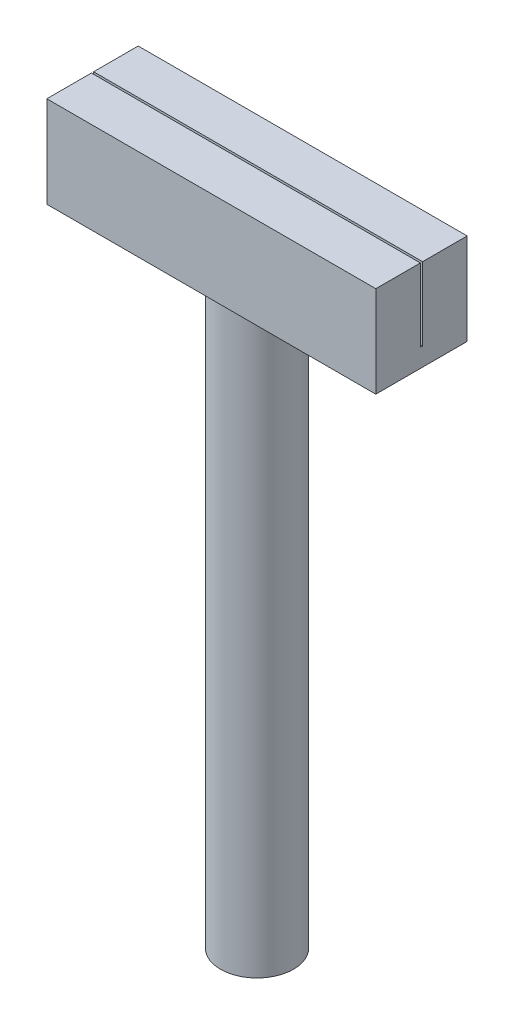
ISO-10303-21;
HEADER;
FILE_DESCRIPTION(('STEP AP214'),'2;1');
FILE_NAME('part.step','',(''),(''),'','','');
FILE_SCHEMA(('AUTOMOTIVE_DESIGN { 1 0 10303 214 1 1 1 1 }'));
ENDSEC;
DATA;
#1=APPLICATION_CONTEXT('core data for automotive mechanical design processes');
#2=APPLICATION_PROTOCOL_DEFINITION('international standard','automotive_design',2000,#1);
#3=PRODUCT_CONTEXT('',#1,'mechanical');
#4=PRODUCT('Part','Part','',(#3));
#5=PRODUCT_RELATED_PRODUCT_CATEGORY('part','',(#4));
#6=PRODUCT_DEFINITION_FORMATION('','',#4);
#7=PRODUCT_DEFINITION_CONTEXT('part definition',#1,'design');
#8=PRODUCT_DEFINITION('design','',#6,#7);
#9=PRODUCT_DEFINITION_SHAPE('','',#8);
#10=(LENGTH_UNIT() NAMED_UNIT(*) SI_UNIT(.MILLI.,.METRE.));
#11=(NAMED_UNIT(*) PLANE_ANGLE_UNIT() SI_UNIT($,.RADIAN.));
#12=(NAMED_UNIT(*) SI_UNIT($,.STERADIAN.) SOLID_ANGLE_UNIT());
#13=UNCERTAINTY_MEASURE_WITH_UNIT(LENGTH_MEASURE(1.E-05),#10,'distance_accuracy_value','');
#14=(GEOMETRIC_REPRESENTATION_CONTEXT(3) GLOBAL_UNCERTAINTY_ASSIGNED_CONTEXT((#13)) GLOBAL_UNIT_ASSIGNED_CONTEXT((#10,
#11,#12)) REPRESENTATION_CONTEXT('',''));
#15=CARTESIAN_POINT('',(0.,0.,0.));
#16=DIRECTION('',(0.,0.,1.));
#17=DIRECTION('',(1.,0.,0.));
#18=AXIS2_PLACEMENT_3D('',#15,#16,#17);
#19=CARTESIAN_POINT('',(0.,92.5,0.));
#20=DIRECTION('',(0.,-1.,0.));
#21=DIRECTION('',(0.,0.,-1.));
#22=AXIS2_PLACEMENT_3D('',#19,#20,#21);
#23=PLANE('',#22);
#24=DIRECTION('',(1.,0.,0.));
#25=VECTOR('',#24,1.);
#26=CARTESIAN_POINT('',(-22.499999958,92.5,0.15));
#27=LINE('',#26,#25);
#28=CARTESIAN_POINT('',(-22.499999958,92.5,0.15));
#29=VERTEX_POINT('',#28);
#30=CARTESIAN_POINT('',(22.499999958,92.5,0.15));
#31=VERTEX_POINT('',#30);
#32=EDGE_CURVE('E120',#29,#31,#27,.T.);
#33=ORIENTED_EDGE('',*,*,#32,.F.);
#34=DIRECTION('',(0.,0.,-1.));
#35=VECTOR('',#34,1.);
#36=CARTESIAN_POINT('',(-22.499999958,92.5,0.));
#37=LINE('',#36,#35);
#38=CARTESIAN_POINT('',(-22.499999958,92.5,6.25));
#39=VERTEX_POINT('',#38);
#40=EDGE_CURVE('E152',#39,#29,#37,.T.);
#41=ORIENTED_EDGE('',*,*,#40,.F.);
#42=DIRECTION('',(-1.,0.,0.));
#43=VECTOR('',#42,1.);
#44=CARTESIAN_POINT('',(0.,92.5,6.25));
#45=LINE('',#44,#43);
#46=CARTESIAN_POINT('',(22.499999958,92.5,6.25));
#47=VERTEX_POINT('',#46);
#48=EDGE_CURVE('E143',#47,#39,#45,.T.);
#49=ORIENTED_EDGE('',*,*,#48,.F.);
#50=DIRECTION('',(0.,0.,1.));
#51=VECTOR('',#50,1.);
#52=CARTESIAN_POINT('',(22.499999958,92.5,0.));
#53=LINE('',#52,#51);
#54=EDGE_CURVE('E131',#31,#47,#53,.T.);
#55=ORIENTED_EDGE('',*,*,#54,.F.);
#56=EDGE_LOOP('',(#33,#41,#49,#55));
#57=FACE_BOUND('',#56,.T.);
#58=ADVANCED_FACE('F44',(#57),#23,.F.);
#59=CARTESIAN_POINT('',(-22.499999958,92.5,0.));
#60=DIRECTION('',(-1.,0.,0.));
#61=DIRECTION('',(0.,0.,1.));
#62=AXIS2_PLACEMENT_3D('',#59,#60,#61);
#63=PLANE('',#62);
#64=DIRECTION('',(0.,0.,-1.));
#65=VECTOR('',#64,1.);
#66=CARTESIAN_POINT('',(-22.499999958,82.5,0.149999999999999));
#67=LINE('',#66,#65);
#68=CARTESIAN_POINT('',(-22.499999958,82.5,0.149999999999999));
#69=VERTEX_POINT('',#68);
#70=CARTESIAN_POINT('',(-22.499999958,82.5,-0.150000000000001));
#71=VERTEX_POINT('',#70);
#72=EDGE_CURVE('E229',#69,#71,#67,.T.);
#73=ORIENTED_EDGE('',*,*,#72,.T.);
#74=DIRECTION('',(0.,1.,0.));
#75=VECTOR('',#74,1.);
#76=CARTESIAN_POINT('',(-22.499999958,92.5,-0.15));
#77=LINE('',#76,#75);
#78=CARTESIAN_POINT('',(-22.499999958,92.5,-0.15));
#79=VERTEX_POINT('',#78);
#80=EDGE_CURVE('E126',#71,#79,#77,.T.);
#81=ORIENTED_EDGE('',*,*,#80,.T.);
#82=CARTESIAN_POINT('',(-22.499999958,92.5,-6.25));
#83=VERTEX_POINT('',#82);
#84=EDGE_CURVE('E69',#79,#83,#37,.T.);
#85=ORIENTED_EDGE('',*,*,#84,.T.);
#86=DIRECTION('',(0.,-1.,0.));
#87=VECTOR('',#86,1.);
#88=CARTESIAN_POINT('',(-22.499999958,92.5,-6.25));
#89=LINE('',#88,#87);
#90=CARTESIAN_POINT('',(-22.499999958,80.,-6.25));
#91=VERTEX_POINT('',#90);
#92=EDGE_CURVE('E90',#83,#91,#89,.T.);
#93=ORIENTED_EDGE('',*,*,#92,.T.);
#94=DIRECTION('',(0.,0.,-1.));
#95=VECTOR('',#94,1.);
#96=CARTESIAN_POINT('',(-22.499999958,80.,0.));
#97=LINE('',#96,#95);
#98=CARTESIAN_POINT('',(-22.499999958,80.,6.25));
#99=VERTEX_POINT('',#98);
#100=EDGE_CURVE('E149',#99,#91,#97,.T.);
#101=ORIENTED_EDGE('',*,*,#100,.F.);
#102=DIRECTION('',(0.,-1.,0.));
#103=VECTOR('',#102,1.);
#104=CARTESIAN_POINT('',(-22.499999958,92.5,6.25));
#105=LINE('',#104,#103);
#106=EDGE_CURVE('E172',#39,#99,#105,.T.);
#107=ORIENTED_EDGE('',*,*,#106,.F.);
#108=ORIENTED_EDGE('',*,*,#40,.T.);
#109=DIRECTION('',(0.,-1.,0.));
#110=VECTOR('',#109,1.);
#111=CARTESIAN_POINT('',(-22.499999958,92.5,0.15));
#112=LINE('',#111,#110);
#113=EDGE_CURVE('E123',#29,#69,#112,.T.);
#114=ORIENTED_EDGE('',*,*,#113,.T.);
#115=EDGE_LOOP('',(#73,#81,#85,#93,#101,#107,#108,#114));
#116=FACE_BOUND('',#115,.T.);
#117=ADVANCED_FACE('F188',(#116),#63,.T.);
#118=CARTESIAN_POINT('',(0.,80.,0.));
#119=DIRECTION('',(0.,-1.,0.));
#120=DIRECTION('',(0.,0.,-1.));
#121=AXIS2_PLACEMENT_3D('',#118,#119,#120);
#122=CYLINDRICAL_SURFACE('',#121,5.);
#123=CARTESIAN_POINT('',(0.,80.,0.));
#124=DIRECTION('',(0.,1.,0.));
#125=DIRECTION('',(0.,0.,1.));
#126=AXIS2_PLACEMENT_3D('',#123,#124,#125);
#127=CIRCLE('',#126,5.);
#128=CARTESIAN_POINT('',(0.,80.,5.));
#129=VERTEX_POINT('',#128);
#130=EDGE_CURVE('E11',#129,#129,#127,.T.);
#131=ORIENTED_EDGE('',*,*,#130,.F.);
#132=EDGE_LOOP('',(#131));
#133=FACE_BOUND('',#132,.T.);
#134=CARTESIAN_POINT('',(0.,0.,0.));
#135=DIRECTION('',(0.,1.,0.));
#136=DIRECTION('',(0.,0.,1.));
#137=AXIS2_PLACEMENT_3D('',#134,#135,#136);
#138=CIRCLE('',#137,5.);
#139=CARTESIAN_POINT('',(0.,0.,5.));
#140=VERTEX_POINT('',#139);
#141=EDGE_CURVE('E47',#140,#140,#138,.T.);
#142=ORIENTED_EDGE('',*,*,#141,.T.);
#143=EDGE_LOOP('',(#142));
#144=FACE_BOUND('',#143,.T.);
#145=ADVANCED_FACE('F50',(#133,#144),#122,.T.);
#146=CARTESIAN_POINT('',(0.,0.,0.));
#147=DIRECTION('',(0.,1.,0.));
#148=DIRECTION('',(0.,0.,1.));
#149=AXIS2_PLACEMENT_3D('',#146,#147,#148);
#150=PLANE('',#149);
#151=ORIENTED_EDGE('',*,*,#141,.F.);
#152=EDGE_LOOP('',(#151));
#153=FACE_BOUND('',#152,.T.);
#154=ADVANCED_FACE('F203',(#153),#150,.F.);
#155=CARTESIAN_POINT('',(0.,92.5,-6.25));
#156=DIRECTION('',(0.,0.,-1.));
#157=DIRECTION('',(-1.,0.,0.));
#158=AXIS2_PLACEMENT_3D('',#155,#156,#157);
#159=PLANE('',#158);
#160=DIRECTION('',(1.,0.,0.));
#161=VECTOR('',#160,1.);
#162=CARTESIAN_POINT('',(0.,80.,-6.25));
#163=LINE('',#162,#161);
#164=CARTESIAN_POINT('',(22.499999958,80.,-6.25));
#165=VERTEX_POINT('',#164);
#166=EDGE_CURVE('E160',#91,#165,#163,.T.);
#167=ORIENTED_EDGE('',*,*,#166,.F.);
#168=ORIENTED_EDGE('',*,*,#92,.F.);
#169=DIRECTION('',(1.,0.,0.));
#170=VECTOR('',#169,1.);
#171=CARTESIAN_POINT('',(0.,92.5,-6.25));
#172=LINE('',#171,#170);
#173=CARTESIAN_POINT('',(22.499999958,92.5,-6.25));
#174=VERTEX_POINT('',#173);
#175=EDGE_CURVE('E145',#83,#174,#172,.T.);
#176=ORIENTED_EDGE('',*,*,#175,.T.);
#177=DIRECTION('',(0.,-1.,0.));
#178=VECTOR('',#177,1.);
#179=CARTESIAN_POINT('',(22.499999958,92.5,-6.25));
#180=LINE('',#179,#178);
#181=EDGE_CURVE('E96',#174,#165,#180,.T.);
#182=ORIENTED_EDGE('',*,*,#181,.T.);
#183=EDGE_LOOP('',(#167,#168,#176,#182));
#184=FACE_BOUND('',#183,.T.);
#185=ADVANCED_FACE('F181',(#184),#159,.T.);
#186=CARTESIAN_POINT('',(0.,92.5,6.25));
#187=DIRECTION('',(0.,0.,1.));
#188=DIRECTION('',(1.,0.,0.));
#189=AXIS2_PLACEMENT_3D('',#186,#187,#188);
#190=PLANE('',#189);
#191=DIRECTION('',(-1.,0.,0.));
#192=VECTOR('',#191,1.);
#193=CARTESIAN_POINT('',(0.,80.,6.25));
#194=LINE('',#193,#192);
#195=CARTESIAN_POINT('',(22.499999958,80.,6.25));
#196=VERTEX_POINT('',#195);
#197=EDGE_CURVE('E167',#196,#99,#194,.T.);
#198=ORIENTED_EDGE('',*,*,#197,.F.);
#199=DIRECTION('',(0.,-1.,0.));
#200=VECTOR('',#199,1.);
#201=CARTESIAN_POINT('',(22.499999958,92.5,6.25));
#202=LINE('',#201,#200);
#203=EDGE_CURVE('E176',#47,#196,#202,.T.);
#204=ORIENTED_EDGE('',*,*,#203,.F.);
#205=ORIENTED_EDGE('',*,*,#48,.T.);
#206=ORIENTED_EDGE('',*,*,#106,.T.);
#207=EDGE_LOOP('',(#198,#204,#205,#206));
#208=FACE_BOUND('',#207,.T.);
#209=ADVANCED_FACE('F193',(#208),#190,.T.);
#210=CARTESIAN_POINT('',(22.499999958,92.5,0.));
#211=DIRECTION('',(1.,0.,0.));
#212=DIRECTION('',(0.,0.,-1.));
#213=AXIS2_PLACEMENT_3D('',#210,#211,#212);
#214=PLANE('',#213);
#215=DIRECTION('',(0.,-1.,0.));
#216=VECTOR('',#215,1.);
#217=CARTESIAN_POINT('',(22.499999958,92.5,0.15));
#218=LINE('',#217,#216);
#219=CARTESIAN_POINT('',(22.499999958,82.5,0.149999999999999));
#220=VERTEX_POINT('',#219);
#221=EDGE_CURVE('E64',#31,#220,#218,.T.);
#222=ORIENTED_EDGE('',*,*,#221,.F.);
#223=ORIENTED_EDGE('',*,*,#54,.T.);
#224=ORIENTED_EDGE('',*,*,#203,.T.);
#225=DIRECTION('',(0.,0.,1.));
#226=VECTOR('',#225,1.);
#227=CARTESIAN_POINT('',(22.499999958,80.,0.));
#228=LINE('',#227,#226);
#229=EDGE_CURVE('E161',#165,#196,#228,.T.);
#230=ORIENTED_EDGE('',*,*,#229,.F.);
#231=ORIENTED_EDGE('',*,*,#181,.F.);
#232=CARTESIAN_POINT('',(22.499999958,92.5,-0.15));
#233=VERTEX_POINT('',#232);
#234=EDGE_CURVE('E141',#174,#233,#53,.T.);
#235=ORIENTED_EDGE('',*,*,#234,.T.);
#236=DIRECTION('',(0.,1.,0.));
#237=VECTOR('',#236,1.);
#238=CARTESIAN_POINT('',(22.499999958,92.5,-0.15));
#239=LINE('',#238,#237);
#240=CARTESIAN_POINT('',(22.499999958,82.5,-0.150000000000001));
#241=VERTEX_POINT('',#240);
#242=EDGE_CURVE('E219',#241,#233,#239,.T.);
#243=ORIENTED_EDGE('',*,*,#242,.F.);
#244=DIRECTION('',(0.,0.,-1.));
#245=VECTOR('',#244,1.);
#246=CARTESIAN_POINT('',(22.499999958,82.5,0.149999999999999));
#247=LINE('',#246,#245);
#248=EDGE_CURVE('E138',#220,#241,#247,.T.);
#249=ORIENTED_EDGE('',*,*,#248,.F.);
#250=EDGE_LOOP('',(#222,#223,#224,#230,#231,#235,#243,#249));
#251=FACE_BOUND('',#250,.T.);
#252=ADVANCED_FACE('F134',(#251),#214,.T.);
#253=ORIENTED_EDGE('',*,*,#84,.F.);
#254=DIRECTION('',(1.,0.,0.));
#255=VECTOR('',#254,1.);
#256=CARTESIAN_POINT('',(-22.499999958,92.5,-0.15));
#257=LINE('',#256,#255);
#258=EDGE_CURVE('E165',#79,#233,#257,.T.);
#259=ORIENTED_EDGE('',*,*,#258,.T.);
#260=ORIENTED_EDGE('',*,*,#234,.F.);
#261=ORIENTED_EDGE('',*,*,#175,.F.);
#262=EDGE_LOOP('',(#253,#259,#260,#261));
#263=FACE_BOUND('',#262,.T.);
#264=ADVANCED_FACE('F200',(#263),#23,.F.);
#265=CARTESIAN_POINT('',(0.,80.,0.));
#266=DIRECTION('',(0.,-1.,0.));
#267=DIRECTION('',(0.,0.,-1.));
#268=AXIS2_PLACEMENT_3D('',#265,#266,#267);
#269=PLANE('',#268);
#270=ORIENTED_EDGE('',*,*,#130,.T.);
#271=EDGE_LOOP('',(#270));
#272=FACE_BOUND('',#271,.T.);
#273=ORIENTED_EDGE('',*,*,#166,.T.);
#274=ORIENTED_EDGE('',*,*,#229,.T.);
#275=ORIENTED_EDGE('',*,*,#197,.T.);
#276=ORIENTED_EDGE('',*,*,#100,.T.);
#277=EDGE_LOOP('',(#273,#274,#275,#276));
#278=FACE_BOUND('',#277,.T.);
#279=ADVANCED_FACE('F186',(#272,#278),#269,.T.);
#280=CARTESIAN_POINT('',(-22.499999958,92.5,-0.15));
#281=DIRECTION('',(0.,0.,-1.));
#282=DIRECTION('',(0.,1.,0.));
#283=AXIS2_PLACEMENT_3D('',#280,#281,#282);
#284=PLANE('',#283);
#285=ORIENTED_EDGE('',*,*,#258,.F.);
#286=ORIENTED_EDGE('',*,*,#80,.F.);
#287=DIRECTION('',(1.,0.,0.));
#288=VECTOR('',#287,1.);
#289=CARTESIAN_POINT('',(-22.499999958,82.5,-0.150000000000001));
#290=LINE('',#289,#288);
#291=EDGE_CURVE('E237',#71,#241,#290,.T.);
#292=ORIENTED_EDGE('',*,*,#291,.T.);
#293=ORIENTED_EDGE('',*,*,#242,.T.);
#294=EDGE_LOOP('',(#285,#286,#292,#293));
#295=FACE_BOUND('',#294,.T.);
#296=ADVANCED_FACE('F216',(#295),#284,.F.);
#297=CARTESIAN_POINT('',(-22.499999958,82.5,0.149999999999999));
#298=DIRECTION('',(0.,-1.,0.));
#299=DIRECTION('',(0.,0.,-1.));
#300=AXIS2_PLACEMENT_3D('',#297,#298,#299);
#301=PLANE('',#300);
#302=ORIENTED_EDGE('',*,*,#291,.F.);
#303=ORIENTED_EDGE('',*,*,#72,.F.);
#304=DIRECTION('',(1.,0.,0.));
#305=VECTOR('',#304,1.);
#306=CARTESIAN_POINT('',(-22.499999958,82.5,0.149999999999999));
#307=LINE('',#306,#305);
#308=EDGE_CURVE('E130',#69,#220,#307,.T.);
#309=ORIENTED_EDGE('',*,*,#308,.T.);
#310=ORIENTED_EDGE('',*,*,#248,.T.);
#311=EDGE_LOOP('',(#302,#303,#309,#310));
#312=FACE_BOUND('',#311,.T.);
#313=ADVANCED_FACE('F241',(#312),#301,.F.);
#314=CARTESIAN_POINT('',(-22.499999958,92.5,0.15));
#315=DIRECTION('',(0.,0.,1.));
#316=DIRECTION('',(0.,-1.,0.));
#317=AXIS2_PLACEMENT_3D('',#314,#315,#316);
#318=PLANE('',#317);
#319=ORIENTED_EDGE('',*,*,#308,.F.);
#320=ORIENTED_EDGE('',*,*,#113,.F.);
#321=ORIENTED_EDGE('',*,*,#32,.T.);
#322=ORIENTED_EDGE('',*,*,#221,.T.);
#323=EDGE_LOOP('',(#319,#320,#321,#322));
#324=FACE_BOUND('',#323,.T.);
#325=ADVANCED_FACE('F118',(#324),#318,.F.);
#326=CLOSED_SHELL('',(#58,#117,#145,#154,#185,#209,#252,#264,#279,#296,#313,#325));
#327=MANIFOLD_SOLID_BREP('B2',#326);
#328=ADVANCED_BREP_SHAPE_REPRESENTATION('',(#18,#327),#14);
#329=SHAPE_DEFINITION_REPRESENTATION(#9,#328);
ENDSEC;
END-ISO-10303-21;
